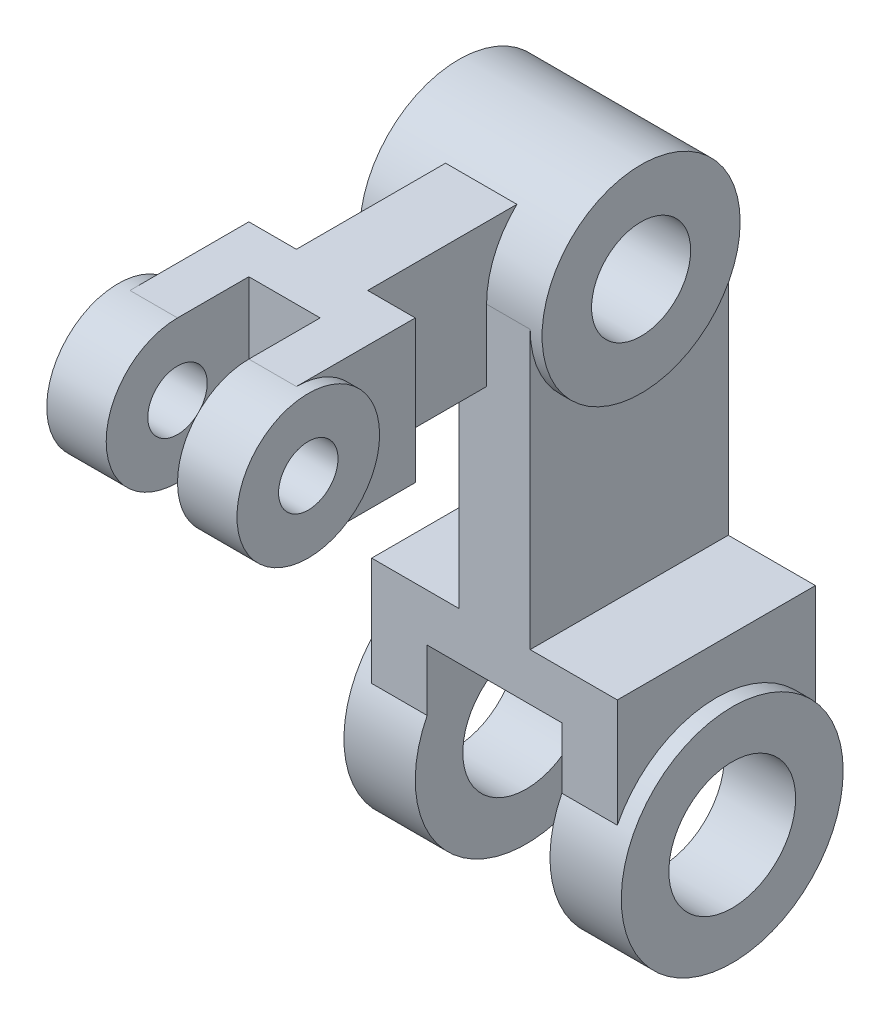
ISO-10303-21;
HEADER;
FILE_DESCRIPTION(('STEP AP214'),'2;1');
FILE_NAME('part.step','',(''),(''),'','','');
FILE_SCHEMA(('AUTOMOTIVE_DESIGN { 1 0 10303 214 1 1 1 1 }'));
ENDSEC;
DATA;
#1=APPLICATION_CONTEXT('core data for automotive mechanical design processes');
#2=APPLICATION_PROTOCOL_DEFINITION('international standard','automotive_design',2000,#1);
#3=PRODUCT_CONTEXT('',#1,'mechanical');
#4=PRODUCT('Part','Part','',(#3));
#5=PRODUCT_RELATED_PRODUCT_CATEGORY('part','',(#4));
#6=PRODUCT_DEFINITION_FORMATION('','',#4);
#7=PRODUCT_DEFINITION_CONTEXT('part definition',#1,'design');
#8=PRODUCT_DEFINITION('design','',#6,#7);
#9=PRODUCT_DEFINITION_SHAPE('','',#8);
#10=(LENGTH_UNIT() NAMED_UNIT(*) SI_UNIT(.MILLI.,.METRE.));
#11=(NAMED_UNIT(*) PLANE_ANGLE_UNIT() SI_UNIT($,.RADIAN.));
#12=(NAMED_UNIT(*) SI_UNIT($,.STERADIAN.) SOLID_ANGLE_UNIT());
#13=UNCERTAINTY_MEASURE_WITH_UNIT(LENGTH_MEASURE(1.E-05),#10,'distance_accuracy_value','');
#14=(GEOMETRIC_REPRESENTATION_CONTEXT(3) GLOBAL_UNCERTAINTY_ASSIGNED_CONTEXT((#13)) GLOBAL_UNIT_ASSIGNED_CONTEXT((#10,
#11,#12)) REPRESENTATION_CONTEXT('',''));
#15=CARTESIAN_POINT('',(0.,0.,0.));
#16=DIRECTION('',(0.,0.,1.));
#17=DIRECTION('',(1.,0.,0.));
#18=AXIS2_PLACEMENT_3D('',#15,#16,#17);
#19=CARTESIAN_POINT('',(9.,18.,0.));
#20=DIRECTION('',(0.,1.,0.));
#21=DIRECTION('',(0.,0.,1.));
#22=AXIS2_PLACEMENT_3D('',#19,#20,#21);
#23=PLANE('',#22);
#24=DIRECTION('',(1.,0.,0.));
#25=VECTOR('',#24,1.);
#26=CARTESIAN_POINT('',(9.,18.,67.));
#27=LINE('',#26,#25);
#28=CARTESIAN_POINT('',(-9.,18.,67.));
#29=VERTEX_POINT('',#28);
#30=CARTESIAN_POINT('',(9.,18.,67.));
#31=VERTEX_POINT('',#30);
#32=EDGE_CURVE('E222',#29,#31,#27,.T.);
#33=ORIENTED_EDGE('',*,*,#32,.T.);
#34=DIRECTION('',(0.,0.,1.));
#35=VECTOR('',#34,1.);
#36=CARTESIAN_POINT('',(8.99999999999999,18.,0.));
#37=LINE('',#36,#35);
#38=CARTESIAN_POINT('',(9.,18.,85.));
#39=VERTEX_POINT('',#38);
#40=EDGE_CURVE('E233',#31,#39,#37,.T.);
#41=ORIENTED_EDGE('',*,*,#40,.T.);
#42=DIRECTION('',(-1.,0.,0.));
#43=VECTOR('',#42,1.);
#44=CARTESIAN_POINT('',(21.,18.,85.));
#45=LINE('',#44,#43);
#46=CARTESIAN_POINT('',(21.,18.,85.));
#47=VERTEX_POINT('',#46);
#48=EDGE_CURVE('E266',#47,#39,#45,.T.);
#49=ORIENTED_EDGE('',*,*,#48,.F.);
#50=DIRECTION('',(0.,0.,-1.));
#51=VECTOR('',#50,1.);
#52=CARTESIAN_POINT('',(21.,18.,0.));
#53=LINE('',#52,#51);
#54=CARTESIAN_POINT('',(21.,18.,55.));
#55=VERTEX_POINT('',#54);
#56=EDGE_CURVE('E252',#47,#55,#53,.T.);
#57=ORIENTED_EDGE('',*,*,#56,.T.);
#58=DIRECTION('',(-1.,0.,0.));
#59=VECTOR('',#58,1.);
#60=CARTESIAN_POINT('',(21.,18.,55.));
#61=LINE('',#60,#59);
#62=CARTESIAN_POINT('',(9.,18.,55.));
#63=VERTEX_POINT('',#62);
#64=EDGE_CURVE('E270',#55,#63,#61,.T.);
#65=ORIENTED_EDGE('',*,*,#64,.T.);
#66=DIRECTION('',(0.,0.,-1.));
#67=VECTOR('',#66,1.);
#68=CARTESIAN_POINT('',(9.,18.,0.));
#69=LINE('',#68,#67);
#70=CARTESIAN_POINT('',(9.,18.,17.3493515728975));
#71=VERTEX_POINT('',#70);
#72=EDGE_CURVE('E293',#63,#71,#69,.T.);
#73=ORIENTED_EDGE('',*,*,#72,.T.);
#74=DIRECTION('',(-1.,0.,0.));
#75=VECTOR('',#74,1.);
#76=CARTESIAN_POINT('',(9.,18.,17.3493515728975));
#77=LINE('',#76,#75);
#78=CARTESIAN_POINT('',(-9.,18.,17.3493515728975));
#79=VERTEX_POINT('',#78);
#80=EDGE_CURVE('E320',#71,#79,#77,.T.);
#81=ORIENTED_EDGE('',*,*,#80,.T.);
#82=DIRECTION('',(0.,0.,-1.));
#83=VECTOR('',#82,1.);
#84=CARTESIAN_POINT('',(-9.,18.,0.));
#85=LINE('',#84,#83);
#86=CARTESIAN_POINT('',(-8.99999999999999,18.,55.));
#87=VERTEX_POINT('',#86);
#88=EDGE_CURVE('E306',#87,#79,#85,.T.);
#89=ORIENTED_EDGE('',*,*,#88,.F.);
#90=CARTESIAN_POINT('',(-21.,18.,55.));
#91=VERTEX_POINT('',#90);
#92=EDGE_CURVE('E269',#87,#91,#61,.T.);
#93=ORIENTED_EDGE('',*,*,#92,.T.);
#94=DIRECTION('',(0.,0.,-1.));
#95=VECTOR('',#94,1.);
#96=CARTESIAN_POINT('',(-21.,18.,0.));
#97=LINE('',#96,#95);
#98=CARTESIAN_POINT('',(-21.,18.,85.));
#99=VERTEX_POINT('',#98);
#100=EDGE_CURVE('E247',#99,#91,#97,.T.);
#101=ORIENTED_EDGE('',*,*,#100,.F.);
#102=CARTESIAN_POINT('',(-8.99999999999999,18.,85.));
#103=VERTEX_POINT('',#102);
#104=EDGE_CURVE('E255',#103,#99,#45,.T.);
#105=ORIENTED_EDGE('',*,*,#104,.F.);
#106=DIRECTION('',(0.,0.,1.));
#107=VECTOR('',#106,1.);
#108=CARTESIAN_POINT('',(-9.00000000000001,18.,0.));
#109=LINE('',#108,#107);
#110=EDGE_CURVE('E52',#29,#103,#109,.T.);
#111=ORIENTED_EDGE('',*,*,#110,.F.);
#112=EDGE_LOOP('',(#33,#41,#49,#57,#65,#73,#81,#89,#93,#101,#105,#111));
#113=FACE_BOUND('',#112,.T.);
#114=ADVANCED_FACE('F37',(#113),#23,.T.);
#115=CARTESIAN_POINT('',(9.,-18.,0.));
#116=DIRECTION('',(0.,1.,0.));
#117=DIRECTION('',(0.,0.,1.));
#118=AXIS2_PLACEMENT_3D('',#115,#116,#117);
#119=PLANE('',#118);
#120=DIRECTION('',(0.,0.,1.));
#121=VECTOR('',#120,1.);
#122=CARTESIAN_POINT('',(8.99999999999999,-18.,0.));
#123=LINE('',#122,#121);
#124=CARTESIAN_POINT('',(9.,-18.,67.));
#125=VERTEX_POINT('',#124);
#126=CARTESIAN_POINT('',(9.,-18.,85.));
#127=VERTEX_POINT('',#126);
#128=EDGE_CURVE('E228',#125,#127,#123,.T.);
#129=ORIENTED_EDGE('',*,*,#128,.F.);
#130=DIRECTION('',(1.,0.,0.));
#131=VECTOR('',#130,1.);
#132=CARTESIAN_POINT('',(9.,-18.,67.));
#133=LINE('',#132,#131);
#134=CARTESIAN_POINT('',(-9.,-18.,67.));
#135=VERTEX_POINT('',#134);
#136=EDGE_CURVE('E11',#135,#125,#133,.T.);
#137=ORIENTED_EDGE('',*,*,#136,.F.);
#138=DIRECTION('',(0.,0.,1.));
#139=VECTOR('',#138,1.);
#140=CARTESIAN_POINT('',(-9.00000000000001,-18.,0.));
#141=LINE('',#140,#139);
#142=CARTESIAN_POINT('',(-9.,-18.,85.));
#143=VERTEX_POINT('',#142);
#144=EDGE_CURVE('E207',#135,#143,#141,.T.);
#145=ORIENTED_EDGE('',*,*,#144,.T.);
#146=DIRECTION('',(-1.,0.,0.));
#147=VECTOR('',#146,1.);
#148=CARTESIAN_POINT('',(21.,-18.,85.));
#149=LINE('',#148,#147);
#150=CARTESIAN_POINT('',(-21.,-18.,85.));
#151=VERTEX_POINT('',#150);
#152=EDGE_CURVE('E276',#143,#151,#149,.T.);
#153=ORIENTED_EDGE('',*,*,#152,.T.);
#154=DIRECTION('',(0.,0.,-1.));
#155=VECTOR('',#154,1.);
#156=CARTESIAN_POINT('',(-21.,-18.,0.));
#157=LINE('',#156,#155);
#158=CARTESIAN_POINT('',(-21.,-18.,55.));
#159=VERTEX_POINT('',#158);
#160=EDGE_CURVE('E258',#151,#159,#157,.T.);
#161=ORIENTED_EDGE('',*,*,#160,.T.);
#162=DIRECTION('',(-1.,0.,0.));
#163=VECTOR('',#162,1.);
#164=CARTESIAN_POINT('',(21.,-18.,55.));
#165=LINE('',#164,#163);
#166=CARTESIAN_POINT('',(-8.99999999999999,-18.,55.));
#167=VERTEX_POINT('',#166);
#168=EDGE_CURVE('E273',#167,#159,#165,.T.);
#169=ORIENTED_EDGE('',*,*,#168,.F.);
#170=DIRECTION('',(0.,0.,-1.));
#171=VECTOR('',#170,1.);
#172=CARTESIAN_POINT('',(-9.,-18.,0.));
#173=LINE('',#172,#171);
#174=CARTESIAN_POINT('',(-9.,-18.,25.));
#175=VERTEX_POINT('',#174);
#176=EDGE_CURVE('E311',#167,#175,#173,.T.);
#177=ORIENTED_EDGE('',*,*,#176,.T.);
#178=DIRECTION('',(-1.,0.,0.));
#179=VECTOR('',#178,1.);
#180=CARTESIAN_POINT('',(9.,-18.,25.));
#181=LINE('',#180,#179);
#182=CARTESIAN_POINT('',(2.,-18.,25.));
#183=VERTEX_POINT('',#182);
#184=EDGE_CURVE('E317',#183,#175,#181,.T.);
#185=ORIENTED_EDGE('',*,*,#184,.F.);
#186=CARTESIAN_POINT('',(9.,-18.,25.));
#187=VERTEX_POINT('',#186);
#188=EDGE_CURVE('E318',#187,#183,#181,.T.);
#189=ORIENTED_EDGE('',*,*,#188,.F.);
#190=DIRECTION('',(0.,0.,-1.));
#191=VECTOR('',#190,1.);
#192=CARTESIAN_POINT('',(9.,-18.,0.));
#193=LINE('',#192,#191);
#194=CARTESIAN_POINT('',(9.,-18.,55.));
#195=VERTEX_POINT('',#194);
#196=EDGE_CURVE('E300',#195,#187,#193,.T.);
#197=ORIENTED_EDGE('',*,*,#196,.F.);
#198=CARTESIAN_POINT('',(21.,-18.,55.));
#199=VERTEX_POINT('',#198);
#200=EDGE_CURVE('E274',#199,#195,#165,.T.);
#201=ORIENTED_EDGE('',*,*,#200,.F.);
#202=DIRECTION('',(0.,0.,-1.));
#203=VECTOR('',#202,1.);
#204=CARTESIAN_POINT('',(21.,-18.,0.));
#205=LINE('',#204,#203);
#206=CARTESIAN_POINT('',(21.,-18.,85.));
#207=VERTEX_POINT('',#206);
#208=EDGE_CURVE('E246',#207,#199,#205,.T.);
#209=ORIENTED_EDGE('',*,*,#208,.F.);
#210=EDGE_CURVE('E230',#207,#127,#149,.T.);
#211=ORIENTED_EDGE('',*,*,#210,.T.);
#212=EDGE_LOOP('',(#129,#137,#145,#153,#161,#169,#177,#185,#189,#197,#201,#209,#211));
#213=FACE_BOUND('',#212,.T.);
#214=ADVANCED_FACE('F226',(#213),#119,.F.);
#215=CARTESIAN_POINT('',(24.,0.,85.));
#216=DIRECTION('',(-1.,0.,0.));
#217=DIRECTION('',(0.,0.,1.));
#218=AXIS2_PLACEMENT_3D('',#215,#216,#217);
#219=CYLINDRICAL_SURFACE('',#218,18.);
#220=CARTESIAN_POINT('',(24.,0.,85.));
#221=DIRECTION('',(1.,0.,0.));
#222=DIRECTION('',(0.,0.,-1.));
#223=AXIS2_PLACEMENT_3D('',#220,#221,#222);
#224=CIRCLE('',#223,18.);
#225=CARTESIAN_POINT('',(24.,0.,67.));
#226=VERTEX_POINT('',#225);
#227=EDGE_CURVE('E285',#226,#226,#224,.T.);
#228=ORIENTED_EDGE('',*,*,#227,.F.);
#229=EDGE_LOOP('',(#228));
#230=FACE_BOUND('',#229,.T.);
#231=CARTESIAN_POINT('',(9.,0.,85.));
#232=DIRECTION('',(-1.,0.,0.));
#233=DIRECTION('',(0.,0.,1.));
#234=AXIS2_PLACEMENT_3D('',#231,#232,#233);
#235=CIRCLE('',#234,18.);
#236=EDGE_CURVE('E234',#127,#39,#235,.T.);
#237=ORIENTED_EDGE('',*,*,#236,.F.);
#238=ORIENTED_EDGE('',*,*,#210,.F.);
#239=CARTESIAN_POINT('',(21.,0.,85.));
#240=DIRECTION('',(1.,0.,0.));
#241=DIRECTION('',(0.,0.,-1.));
#242=AXIS2_PLACEMENT_3D('',#239,#240,#241);
#243=CIRCLE('',#242,18.);
#244=EDGE_CURVE('E244',#207,#47,#243,.T.);
#245=ORIENTED_EDGE('',*,*,#244,.T.);
#246=ORIENTED_EDGE('',*,*,#48,.T.);
#247=EDGE_LOOP('',(#237,#238,#245,#246));
#248=FACE_BOUND('',#247,.T.);
#249=ADVANCED_FACE('F541',(#230,#248),#219,.T.);
#250=CARTESIAN_POINT('',(24.,0.,85.));
#251=DIRECTION('',(-1.,0.,0.));
#252=DIRECTION('',(0.,0.,1.));
#253=AXIS2_PLACEMENT_3D('',#250,#251,#252);
#254=CYLINDRICAL_SURFACE('',#253,7.50000000000001);
#255=CARTESIAN_POINT('',(24.,0.,85.));
#256=DIRECTION('',(1.,0.,0.));
#257=DIRECTION('',(0.,0.,-1.));
#258=AXIS2_PLACEMENT_3D('',#255,#256,#257);
#259=CIRCLE('',#258,7.50000000000001);
#260=CARTESIAN_POINT('',(24.,0.,77.5));
#261=VERTEX_POINT('',#260);
#262=EDGE_CURVE('E279',#261,#261,#259,.T.);
#263=ORIENTED_EDGE('',*,*,#262,.T.);
#264=EDGE_LOOP('',(#263));
#265=FACE_BOUND('',#264,.T.);
#266=CARTESIAN_POINT('',(9.,0.,85.));
#267=DIRECTION('',(-1.,0.,0.));
#268=DIRECTION('',(0.,0.,1.));
#269=AXIS2_PLACEMENT_3D('',#266,#267,#268);
#270=CIRCLE('',#269,7.50000000000001);
#271=CARTESIAN_POINT('',(9.00000000000001,0.,92.5));
#272=VERTEX_POINT('',#271);
#273=EDGE_CURVE('E238',#272,#272,#270,.T.);
#274=ORIENTED_EDGE('',*,*,#273,.T.);
#275=EDGE_LOOP('',(#274));
#276=FACE_BOUND('',#275,.T.);
#277=ADVANCED_FACE('F599',(#265,#276),#254,.F.);
#278=CARTESIAN_POINT('',(2.,0.,25.));
#279=DIRECTION('',(0.,0.,1.));
#280=DIRECTION('',(0.,-1.,0.));
#281=AXIS2_PLACEMENT_3D('',#278,#279,#280);
#282=PLANE('',#281);
#283=DIRECTION('',(0.,1.,0.));
#284=VECTOR('',#283,1.);
#285=CARTESIAN_POINT('',(9.,0.,25.));
#286=LINE('',#285,#284);
#287=CARTESIAN_POINT('',(9.,0.,25.));
#288=VERTEX_POINT('',#287);
#289=EDGE_CURVE('E60',#187,#288,#286,.T.);
#290=ORIENTED_EDGE('',*,*,#289,.F.);
#291=ORIENTED_EDGE('',*,*,#188,.T.);
#292=DIRECTION('',(0.,-1.,0.));
#293=VECTOR('',#292,1.);
#294=CARTESIAN_POINT('',(2.,0.,25.));
#295=LINE('',#294,#293);
#296=CARTESIAN_POINT('',(2.,-70.,25.));
#297=VERTEX_POINT('',#296);
#298=EDGE_CURVE('E404',#183,#297,#295,.T.);
#299=ORIENTED_EDGE('',*,*,#298,.T.);
#300=DIRECTION('',(-1.,0.,0.));
#301=VECTOR('',#300,1.);
#302=CARTESIAN_POINT('',(42.,-70.,25.));
#303=LINE('',#302,#301);
#304=CARTESIAN_POINT('',(-20.,-70.,25.));
#305=VERTEX_POINT('',#304);
#306=EDGE_CURVE('E388',#297,#305,#303,.T.);
#307=ORIENTED_EDGE('',*,*,#306,.T.);
#308=DIRECTION('',(0.,-1.,0.));
#309=VECTOR('',#308,1.);
#310=CARTESIAN_POINT('',(-20.,0.,25.));
#311=LINE('',#310,#309);
#312=CARTESIAN_POINT('',(-20.,-97.3904797870815,25.));
#313=VERTEX_POINT('',#312);
#314=EDGE_CURVE('E365',#305,#313,#311,.T.);
#315=ORIENTED_EDGE('',*,*,#314,.T.);
#316=DIRECTION('',(-1.,0.,0.));
#317=VECTOR('',#316,1.);
#318=CARTESIAN_POINT('',(42.,-97.3904797870815,25.));
#319=LINE('',#318,#317);
#320=CARTESIAN_POINT('',(-6.,-97.3904797870815,25.));
#321=VERTEX_POINT('',#320);
#322=EDGE_CURVE('E374',#321,#313,#319,.T.);
#323=ORIENTED_EDGE('',*,*,#322,.F.);
#324=DIRECTION('',(0.,-1.,0.));
#325=VECTOR('',#324,1.);
#326=CARTESIAN_POINT('',(-6.00000000000001,0.,25.));
#327=LINE('',#326,#325);
#328=CARTESIAN_POINT('',(-5.99999999999999,-82.,25.));
#329=VERTEX_POINT('',#328);
#330=EDGE_CURVE('E329',#329,#321,#327,.T.);
#331=ORIENTED_EDGE('',*,*,#330,.F.);
#332=DIRECTION('',(1.,0.,0.));
#333=VECTOR('',#332,1.);
#334=CARTESIAN_POINT('',(2.,-82.,25.));
#335=LINE('',#334,#333);
#336=CARTESIAN_POINT('',(28.,-82.,25.));
#337=VERTEX_POINT('',#336);
#338=EDGE_CURVE('E45',#329,#337,#335,.T.);
#339=ORIENTED_EDGE('',*,*,#338,.T.);
#340=DIRECTION('',(0.,-1.,0.));
#341=VECTOR('',#340,1.);
#342=CARTESIAN_POINT('',(28.,0.,25.));
#343=LINE('',#342,#341);
#344=CARTESIAN_POINT('',(28.,-97.3904797870815,25.));
#345=VERTEX_POINT('',#344);
#346=EDGE_CURVE('E337',#337,#345,#343,.T.);
#347=ORIENTED_EDGE('',*,*,#346,.T.);
#348=CARTESIAN_POINT('',(42.,-97.3904797870815,25.));
#349=VERTEX_POINT('',#348);
#350=EDGE_CURVE('E385',#349,#345,#319,.T.);
#351=ORIENTED_EDGE('',*,*,#350,.F.);
#352=DIRECTION('',(0.,-1.,0.));
#353=VECTOR('',#352,1.);
#354=CARTESIAN_POINT('',(42.,0.,25.));
#355=LINE('',#354,#353);
#356=CARTESIAN_POINT('',(42.,-70.,25.));
#357=VERTEX_POINT('',#356);
#358=EDGE_CURVE('E371',#357,#349,#355,.T.);
#359=ORIENTED_EDGE('',*,*,#358,.F.);
#360=CARTESIAN_POINT('',(20.,-70.,25.));
#361=VERTEX_POINT('',#360);
#362=EDGE_CURVE('E389',#357,#361,#303,.T.);
#363=ORIENTED_EDGE('',*,*,#362,.T.);
#364=DIRECTION('',(0.,-1.,0.));
#365=VECTOR('',#364,1.);
#366=CARTESIAN_POINT('',(20.,0.,25.));
#367=LINE('',#366,#365);
#368=CARTESIAN_POINT('',(20.,0.,25.));
#369=VERTEX_POINT('',#368);
#370=EDGE_CURVE('E418',#369,#361,#367,.T.);
#371=ORIENTED_EDGE('',*,*,#370,.F.);
#372=DIRECTION('',(1.,0.,0.));
#373=VECTOR('',#372,1.);
#374=CARTESIAN_POINT('',(2.,0.,25.));
#375=LINE('',#374,#373);
#376=EDGE_CURVE('E415',#288,#369,#375,.T.);
#377=ORIENTED_EDGE('',*,*,#376,.F.);
#378=EDGE_LOOP('',(#290,#291,#299,#307,#315,#323,#331,#339,#347,#351,#359,#363,#371,#377));
#379=FACE_BOUND('',#378,.T.);
#380=ADVANCED_FACE('F479',(#379),#282,.T.);
#381=CARTESIAN_POINT('',(2.,-70.,-25.));
#382=DIRECTION('',(0.,0.,-1.));
#383=DIRECTION('',(-1.,0.,0.));
#384=AXIS2_PLACEMENT_3D('',#381,#382,#383);
#385=PLANE('',#384);
#386=DIRECTION('',(-1.,0.,0.));
#387=VECTOR('',#386,1.);
#388=CARTESIAN_POINT('',(42.,-97.3904797870815,-25.));
#389=LINE('',#388,#387);
#390=CARTESIAN_POINT('',(42.,-97.3904797870816,-25.));
#391=VERTEX_POINT('',#390);
#392=CARTESIAN_POINT('',(28.,-97.3904797870815,-25.));
#393=VERTEX_POINT('',#392);
#394=EDGE_CURVE('E397',#391,#393,#389,.T.);
#395=ORIENTED_EDGE('',*,*,#394,.T.);
#396=DIRECTION('',(0.,1.,0.));
#397=VECTOR('',#396,1.);
#398=CARTESIAN_POINT('',(28.,-70.,-25.));
#399=LINE('',#398,#397);
#400=CARTESIAN_POINT('',(28.,-82.,-25.));
#401=VERTEX_POINT('',#400);
#402=EDGE_CURVE('E340',#393,#401,#399,.T.);
#403=ORIENTED_EDGE('',*,*,#402,.T.);
#404=DIRECTION('',(-1.,0.,0.));
#405=VECTOR('',#404,1.);
#406=CARTESIAN_POINT('',(2.,-82.,-25.));
#407=LINE('',#406,#405);
#408=CARTESIAN_POINT('',(-5.99999999999999,-82.,-25.));
#409=VERTEX_POINT('',#408);
#410=EDGE_CURVE('E346',#401,#409,#407,.T.);
#411=ORIENTED_EDGE('',*,*,#410,.T.);
#412=DIRECTION('',(0.,1.,0.));
#413=VECTOR('',#412,1.);
#414=CARTESIAN_POINT('',(-6.,-70.,-25.));
#415=LINE('',#414,#413);
#416=CARTESIAN_POINT('',(-6.,-97.3904797870815,-25.));
#417=VERTEX_POINT('',#416);
#418=EDGE_CURVE('E332',#417,#409,#415,.T.);
#419=ORIENTED_EDGE('',*,*,#418,.F.);
#420=CARTESIAN_POINT('',(-20.,-97.3904797870815,-25.));
#421=VERTEX_POINT('',#420);
#422=EDGE_CURVE('E396',#417,#421,#389,.T.);
#423=ORIENTED_EDGE('',*,*,#422,.T.);
#424=DIRECTION('',(0.,-1.,0.));
#425=VECTOR('',#424,1.);
#426=CARTESIAN_POINT('',(-20.,0.,-25.));
#427=LINE('',#426,#425);
#428=CARTESIAN_POINT('',(-20.,-70.,-25.));
#429=VERTEX_POINT('',#428);
#430=EDGE_CURVE('E377',#429,#421,#427,.T.);
#431=ORIENTED_EDGE('',*,*,#430,.F.);
#432=DIRECTION('',(-1.,0.,0.));
#433=VECTOR('',#432,1.);
#434=CARTESIAN_POINT('',(42.,-70.,-25.));
#435=LINE('',#434,#433);
#436=CARTESIAN_POINT('',(2.,-70.,-25.));
#437=VERTEX_POINT('',#436);
#438=EDGE_CURVE('E392',#437,#429,#435,.T.);
#439=ORIENTED_EDGE('',*,*,#438,.F.);
#440=DIRECTION('',(0.,1.,0.));
#441=VECTOR('',#440,1.);
#442=CARTESIAN_POINT('',(2.,-70.,-25.));
#443=LINE('',#442,#441);
#444=CARTESIAN_POINT('',(2.,0.,-25.));
#445=VERTEX_POINT('',#444);
#446=EDGE_CURVE('E412',#437,#445,#443,.T.);
#447=ORIENTED_EDGE('',*,*,#446,.T.);
#448=DIRECTION('',(1.,0.,0.));
#449=VECTOR('',#448,1.);
#450=CARTESIAN_POINT('',(2.,0.,-25.));
#451=LINE('',#450,#449);
#452=CARTESIAN_POINT('',(20.,0.,-25.));
#453=VERTEX_POINT('',#452);
#454=EDGE_CURVE('E423',#445,#453,#451,.T.);
#455=ORIENTED_EDGE('',*,*,#454,.T.);
#456=DIRECTION('',(0.,1.,0.));
#457=VECTOR('',#456,1.);
#458=CARTESIAN_POINT('',(20.,-70.,-25.));
#459=LINE('',#458,#457);
#460=CARTESIAN_POINT('',(20.,-70.,-25.));
#461=VERTEX_POINT('',#460);
#462=EDGE_CURVE('E405',#461,#453,#459,.T.);
#463=ORIENTED_EDGE('',*,*,#462,.F.);
#464=CARTESIAN_POINT('',(42.,-70.,-25.));
#465=VERTEX_POINT('',#464);
#466=EDGE_CURVE('E393',#465,#461,#435,.T.);
#467=ORIENTED_EDGE('',*,*,#466,.F.);
#468=DIRECTION('',(0.,-1.,0.));
#469=VECTOR('',#468,1.);
#470=CARTESIAN_POINT('',(42.,0.,-25.));
#471=LINE('',#470,#469);
#472=EDGE_CURVE('E364',#465,#391,#471,.T.);
#473=ORIENTED_EDGE('',*,*,#472,.T.);
#474=EDGE_LOOP('',(#395,#403,#411,#419,#423,#431,#439,#447,#455,#463,#467,#473));
#475=FACE_BOUND('',#474,.T.);
#476=ADVANCED_FACE('F506',(#475),#385,.T.);
#477=CARTESIAN_POINT('',(46.,-110.,0.));
#478=DIRECTION('',(-1.,0.,0.));
#479=DIRECTION('',(0.,0.,1.));
#480=AXIS2_PLACEMENT_3D('',#477,#478,#479);
#481=CYLINDRICAL_SURFACE('',#480,16.);
#482=CARTESIAN_POINT('',(46.,-110.,0.));
#483=DIRECTION('',(1.,0.,0.));
#484=DIRECTION('',(0.,0.,-1.));
#485=AXIS2_PLACEMENT_3D('',#482,#483,#484);
#486=CIRCLE('',#485,16.);
#487=CARTESIAN_POINT('',(46.,-110.,-16.));
#488=VERTEX_POINT('',#487);
#489=EDGE_CURVE('E350',#488,#488,#486,.T.);
#490=ORIENTED_EDGE('',*,*,#489,.T.);
#491=EDGE_LOOP('',(#490));
#492=FACE_BOUND('',#491,.T.);
#493=CARTESIAN_POINT('',(28.,-110.,0.));
#494=DIRECTION('',(-1.,0.,0.));
#495=DIRECTION('',(0.,-1.,0.));
#496=AXIS2_PLACEMENT_3D('',#493,#494,#495);
#497=CIRCLE('',#496,16.);
#498=CARTESIAN_POINT('',(28.,-126.,0.));
#499=VERTEX_POINT('',#498);
#500=EDGE_CURVE('E343',#499,#499,#497,.T.);
#501=ORIENTED_EDGE('',*,*,#500,.T.);
#502=EDGE_LOOP('',(#501));
#503=FACE_BOUND('',#502,.T.);
#504=ADVANCED_FACE('F579',(#492,#503),#481,.F.);
#505=CARTESIAN_POINT('',(46.,-110.,0.));
#506=DIRECTION('',(-1.,0.,0.));
#507=DIRECTION('',(0.,0.,1.));
#508=AXIS2_PLACEMENT_3D('',#505,#506,#507);
#509=CYLINDRICAL_SURFACE('',#508,28.);
#510=CARTESIAN_POINT('',(46.,-110.,0.));
#511=DIRECTION('',(1.,0.,0.));
#512=DIRECTION('',(0.,0.,-1.));
#513=AXIS2_PLACEMENT_3D('',#510,#511,#512);
#514=CIRCLE('',#513,28.);
#515=CARTESIAN_POINT('',(46.,-110.,-28.));
#516=VERTEX_POINT('',#515);
#517=EDGE_CURVE('E353',#516,#516,#514,.T.);
#518=ORIENTED_EDGE('',*,*,#517,.F.);
#519=EDGE_LOOP('',(#518));
#520=FACE_BOUND('',#519,.T.);
#521=ORIENTED_EDGE('',*,*,#350,.T.);
#522=CARTESIAN_POINT('',(28.,-110.,0.));
#523=DIRECTION('',(-1.,0.,0.));
#524=DIRECTION('',(0.,-1.,0.));
#525=AXIS2_PLACEMENT_3D('',#522,#523,#524);
#526=CIRCLE('',#525,28.);
#527=EDGE_CURVE('E441',#393,#345,#526,.T.);
#528=ORIENTED_EDGE('',*,*,#527,.F.);
#529=ORIENTED_EDGE('',*,*,#394,.F.);
#530=CARTESIAN_POINT('',(42.,-110.,0.));
#531=DIRECTION('',(1.,0.,0.));
#532=DIRECTION('',(0.,0.,-1.));
#533=AXIS2_PLACEMENT_3D('',#530,#531,#532);
#534=CIRCLE('',#533,28.);
#535=EDGE_CURVE('E362',#391,#349,#534,.T.);
#536=ORIENTED_EDGE('',*,*,#535,.T.);
#537=EDGE_LOOP('',(#521,#528,#529,#536));
#538=FACE_BOUND('',#537,.T.);
#539=ADVANCED_FACE('F513',(#520,#538),#509,.T.);
#540=CARTESIAN_POINT('',(-24.,-110.,0.));
#541=DIRECTION('',(1.,0.,0.));
#542=DIRECTION('',(0.,0.,-1.));
#543=AXIS2_PLACEMENT_3D('',#540,#541,#542);
#544=CIRCLE('',#543,28.);
#545=CARTESIAN_POINT('',(-24.,-110.,-28.));
#546=VERTEX_POINT('',#545);
#547=EDGE_CURVE('E354',#546,#546,#544,.T.);
#548=ORIENTED_EDGE('',*,*,#547,.T.);
#549=EDGE_LOOP('',(#548));
#550=FACE_BOUND('',#549,.T.);
#551=CARTESIAN_POINT('',(-6.,-110.,0.));
#552=DIRECTION('',(-1.,0.,0.));
#553=DIRECTION('',(0.,-1.,0.));
#554=AXIS2_PLACEMENT_3D('',#551,#552,#553);
#555=CIRCLE('',#554,28.);
#556=EDGE_CURVE('E437',#417,#321,#555,.T.);
#557=ORIENTED_EDGE('',*,*,#556,.T.);
#558=ORIENTED_EDGE('',*,*,#322,.T.);
#559=CARTESIAN_POINT('',(-20.,-110.,0.));
#560=DIRECTION('',(1.,0.,0.));
#561=DIRECTION('',(0.,0.,-1.));
#562=AXIS2_PLACEMENT_3D('',#559,#560,#561);
#563=CIRCLE('',#562,28.);
#564=EDGE_CURVE('E357',#421,#313,#563,.T.);
#565=ORIENTED_EDGE('',*,*,#564,.F.);
#566=ORIENTED_EDGE('',*,*,#422,.F.);
#567=EDGE_LOOP('',(#557,#558,#565,#566));
#568=FACE_BOUND('',#567,.T.);
#569=ADVANCED_FACE('F496',(#550,#568),#509,.T.);
#570=CARTESIAN_POINT('',(23.,0.,0.));
#571=DIRECTION('',(-1.,0.,0.));
#572=DIRECTION('',(0.,0.,1.));
#573=AXIS2_PLACEMENT_3D('',#570,#571,#572);
#574=CYLINDRICAL_SURFACE('',#573,25.);
#575=CARTESIAN_POINT('',(-23.,0.,0.));
#576=DIRECTION('',(1.,0.,0.));
#577=DIRECTION('',(0.,0.,-1.));
#578=AXIS2_PLACEMENT_3D('',#575,#576,#577);
#579=CIRCLE('',#578,25.);
#580=CARTESIAN_POINT('',(-23.,0.,-25.));
#581=VERTEX_POINT('',#580);
#582=EDGE_CURVE('E431',#581,#581,#579,.T.);
#583=ORIENTED_EDGE('',*,*,#582,.T.);
#584=EDGE_LOOP('',(#583));
#585=FACE_BOUND('',#584,.T.);
#586=CARTESIAN_POINT('',(23.,0.,0.));
#587=DIRECTION('',(1.,0.,0.));
#588=DIRECTION('',(0.,0.,-1.));
#589=AXIS2_PLACEMENT_3D('',#586,#587,#588);
#590=CIRCLE('',#589,25.);
#591=CARTESIAN_POINT('',(23.,0.,-25.));
#592=VERTEX_POINT('',#591);
#593=EDGE_CURVE('E434',#592,#592,#590,.T.);
#594=ORIENTED_EDGE('',*,*,#593,.F.);
#595=EDGE_LOOP('',(#594));
#596=FACE_BOUND('',#595,.T.);
#597=ORIENTED_EDGE('',*,*,#80,.F.);
#598=CARTESIAN_POINT('',(9.,0.,0.));
#599=DIRECTION('',(1.,0.,0.));
#600=DIRECTION('',(0.,0.,-1.));
#601=AXIS2_PLACEMENT_3D('',#598,#599,#600);
#602=CIRCLE('',#601,25.);
#603=EDGE_CURVE('E291',#71,#288,#602,.T.);
#604=ORIENTED_EDGE('',*,*,#603,.T.);
#605=ORIENTED_EDGE('',*,*,#376,.T.);
#606=CARTESIAN_POINT('',(20.,0.,0.));
#607=DIRECTION('',(-1.,0.,0.));
#608=DIRECTION('',(0.,0.,-1.));
#609=AXIS2_PLACEMENT_3D('',#606,#607,#608);
#610=CIRCLE('',#609,25.);
#611=EDGE_CURVE('E400',#453,#369,#610,.T.);
#612=ORIENTED_EDGE('',*,*,#611,.F.);
#613=ORIENTED_EDGE('',*,*,#454,.F.);
#614=CARTESIAN_POINT('',(2.,0.,0.));
#615=DIRECTION('',(-1.,0.,0.));
#616=DIRECTION('',(0.,0.,-1.));
#617=AXIS2_PLACEMENT_3D('',#614,#615,#616);
#618=CIRCLE('',#617,25.);
#619=CARTESIAN_POINT('',(2.,0.,25.));
#620=VERTEX_POINT('',#619);
#621=EDGE_CURVE('E401',#445,#620,#618,.T.);
#622=ORIENTED_EDGE('',*,*,#621,.T.);
#623=DIRECTION('',(-1.,0.,0.));
#624=VECTOR('',#623,1.);
#625=CARTESIAN_POINT('',(9.,0.,25.));
#626=LINE('',#625,#624);
#627=CARTESIAN_POINT('',(-9.,0.,25.));
#628=VERTEX_POINT('',#627);
#629=EDGE_CURVE('E303',#620,#628,#626,.T.);
#630=ORIENTED_EDGE('',*,*,#629,.T.);
#631=CARTESIAN_POINT('',(-9.,0.,0.));
#632=DIRECTION('',(1.,0.,0.));
#633=DIRECTION('',(0.,0.,-1.));
#634=AXIS2_PLACEMENT_3D('',#631,#632,#633);
#635=CIRCLE('',#634,25.);
#636=EDGE_CURVE('E288',#79,#628,#635,.T.);
#637=ORIENTED_EDGE('',*,*,#636,.F.);
#638=EDGE_LOOP('',(#597,#604,#605,#612,#613,#622,#630,#637));
#639=FACE_BOUND('',#638,.T.);
#640=ADVANCED_FACE('F39',(#585,#596,#639),#574,.T.);
#641=CARTESIAN_POINT('',(23.,0.,0.));
#642=DIRECTION('',(1.,0.,0.));
#643=DIRECTION('',(0.,0.,-1.));
#644=AXIS2_PLACEMENT_3D('',#641,#642,#643);
#645=PLANE('',#644);
#646=ORIENTED_EDGE('',*,*,#593,.T.);
#647=EDGE_LOOP('',(#646));
#648=FACE_BOUND('',#647,.T.);
#649=CARTESIAN_POINT('',(23.,0.,0.));
#650=DIRECTION('',(1.,0.,0.));
#651=DIRECTION('',(0.,0.,-1.));
#652=AXIS2_PLACEMENT_3D('',#649,#650,#651);
#653=CIRCLE('',#652,12.5);
#654=CARTESIAN_POINT('',(23.,0.,-12.5));
#655=VERTEX_POINT('',#654);
#656=EDGE_CURVE('E428',#655,#655,#653,.T.);
#657=ORIENTED_EDGE('',*,*,#656,.F.);
#658=EDGE_LOOP('',(#657));
#659=FACE_BOUND('',#658,.T.);
#660=ADVANCED_FACE('F604',(#648,#659),#645,.T.);
#661=CARTESIAN_POINT('',(-23.,0.,0.));
#662=DIRECTION('',(1.,0.,0.));
#663=DIRECTION('',(0.,0.,-1.));
#664=AXIS2_PLACEMENT_3D('',#661,#662,#663);
#665=PLANE('',#664);
#666=ORIENTED_EDGE('',*,*,#582,.F.);
#667=EDGE_LOOP('',(#666));
#668=FACE_BOUND('',#667,.T.);
#669=CARTESIAN_POINT('',(-23.,0.,0.));
#670=DIRECTION('',(1.,0.,0.));
#671=DIRECTION('',(0.,0.,-1.));
#672=AXIS2_PLACEMENT_3D('',#669,#670,#671);
#673=CIRCLE('',#672,12.5);
#674=CARTESIAN_POINT('',(-23.,0.,-12.5));
#675=VERTEX_POINT('',#674);
#676=EDGE_CURVE('E426',#675,#675,#673,.T.);
#677=ORIENTED_EDGE('',*,*,#676,.T.);
#678=EDGE_LOOP('',(#677));
#679=FACE_BOUND('',#678,.T.);
#680=ADVANCED_FACE('F602',(#668,#679),#665,.F.);
#681=CARTESIAN_POINT('',(23.,0.,0.));
#682=DIRECTION('',(-1.,0.,0.));
#683=DIRECTION('',(0.,0.,1.));
#684=AXIS2_PLACEMENT_3D('',#681,#682,#683);
#685=CYLINDRICAL_SURFACE('',#684,12.5);
#686=ORIENTED_EDGE('',*,*,#656,.T.);
#687=EDGE_LOOP('',(#686));
#688=FACE_BOUND('',#687,.T.);
#689=ORIENTED_EDGE('',*,*,#676,.F.);
#690=EDGE_LOOP('',(#689));
#691=FACE_BOUND('',#690,.T.);
#692=ADVANCED_FACE('F592',(#688,#691),#685,.F.);
#693=CARTESIAN_POINT('',(2.,0.,0.));
#694=DIRECTION('',(1.,0.,0.));
#695=DIRECTION('',(0.,0.,-1.));
#696=AXIS2_PLACEMENT_3D('',#693,#694,#695);
#697=PLANE('',#696);
#698=ORIENTED_EDGE('',*,*,#621,.F.);
#699=ORIENTED_EDGE('',*,*,#446,.F.);
#700=DIRECTION('',(0.,0.,-1.));
#701=VECTOR('',#700,1.);
#702=CARTESIAN_POINT('',(2.,-70.,25.));
#703=LINE('',#702,#701);
#704=EDGE_CURVE('E409',#297,#437,#703,.T.);
#705=ORIENTED_EDGE('',*,*,#704,.F.);
#706=ORIENTED_EDGE('',*,*,#298,.F.);
#707=EDGE_CURVE('E406',#620,#183,#295,.T.);
#708=ORIENTED_EDGE('',*,*,#707,.F.);
#709=EDGE_LOOP('',(#698,#699,#705,#706,#708));
#710=FACE_BOUND('',#709,.T.);
#711=ADVANCED_FACE('F484',(#710),#697,.F.);
#712=CARTESIAN_POINT('',(20.,0.,0.));
#713=DIRECTION('',(1.,0.,0.));
#714=DIRECTION('',(0.,0.,-1.));
#715=AXIS2_PLACEMENT_3D('',#712,#713,#714);
#716=PLANE('',#715);
#717=ORIENTED_EDGE('',*,*,#611,.T.);
#718=ORIENTED_EDGE('',*,*,#370,.T.);
#719=DIRECTION('',(0.,0.,-1.));
#720=VECTOR('',#719,1.);
#721=CARTESIAN_POINT('',(20.,-70.,25.));
#722=LINE('',#721,#720);
#723=EDGE_CURVE('E420',#361,#461,#722,.T.);
#724=ORIENTED_EDGE('',*,*,#723,.T.);
#725=ORIENTED_EDGE('',*,*,#462,.T.);
#726=EDGE_LOOP('',(#717,#718,#724,#725));
#727=FACE_BOUND('',#726,.T.);
#728=ADVANCED_FACE('F525',(#727),#716,.T.);
#729=CARTESIAN_POINT('',(42.,-70.,0.));
#730=DIRECTION('',(0.,1.,0.));
#731=DIRECTION('',(0.,0.,1.));
#732=AXIS2_PLACEMENT_3D('',#729,#730,#731);
#733=PLANE('',#732);
#734=ORIENTED_EDGE('',*,*,#723,.F.);
#735=ORIENTED_EDGE('',*,*,#362,.F.);
#736=DIRECTION('',(0.,0.,-1.));
#737=VECTOR('',#736,1.);
#738=CARTESIAN_POINT('',(42.,-70.,0.));
#739=LINE('',#738,#737);
#740=EDGE_CURVE('E368',#357,#465,#739,.T.);
#741=ORIENTED_EDGE('',*,*,#740,.T.);
#742=ORIENTED_EDGE('',*,*,#466,.T.);
#743=EDGE_LOOP('',(#734,#735,#741,#742));
#744=FACE_BOUND('',#743,.T.);
#745=ADVANCED_FACE('F522',(#744),#733,.T.);
#746=ORIENTED_EDGE('',*,*,#306,.F.);
#747=ORIENTED_EDGE('',*,*,#704,.T.);
#748=ORIENTED_EDGE('',*,*,#438,.T.);
#749=DIRECTION('',(0.,0.,-1.));
#750=VECTOR('',#749,1.);
#751=CARTESIAN_POINT('',(-20.,-70.,0.));
#752=LINE('',#751,#750);
#753=EDGE_CURVE('E380',#305,#429,#752,.T.);
#754=ORIENTED_EDGE('',*,*,#753,.F.);
#755=EDGE_LOOP('',(#746,#747,#748,#754));
#756=FACE_BOUND('',#755,.T.);
#757=ADVANCED_FACE('F488',(#756),#733,.T.);
#758=CARTESIAN_POINT('',(42.,0.,0.));
#759=DIRECTION('',(1.,0.,0.));
#760=DIRECTION('',(0.,0.,-1.));
#761=AXIS2_PLACEMENT_3D('',#758,#759,#760);
#762=PLANE('',#761);
#763=ORIENTED_EDGE('',*,*,#535,.F.);
#764=ORIENTED_EDGE('',*,*,#472,.F.);
#765=ORIENTED_EDGE('',*,*,#740,.F.);
#766=ORIENTED_EDGE('',*,*,#358,.T.);
#767=EDGE_LOOP('',(#763,#764,#765,#766));
#768=FACE_BOUND('',#767,.T.);
#769=ADVANCED_FACE('F518',(#768),#762,.T.);
#770=CARTESIAN_POINT('',(-20.,0.,0.));
#771=DIRECTION('',(1.,0.,0.));
#772=DIRECTION('',(0.,0.,-1.));
#773=AXIS2_PLACEMENT_3D('',#770,#771,#772);
#774=PLANE('',#773);
#775=ORIENTED_EDGE('',*,*,#564,.T.);
#776=ORIENTED_EDGE('',*,*,#314,.F.);
#777=ORIENTED_EDGE('',*,*,#753,.T.);
#778=ORIENTED_EDGE('',*,*,#430,.T.);
#779=EDGE_LOOP('',(#775,#776,#777,#778));
#780=FACE_BOUND('',#779,.T.);
#781=ADVANCED_FACE('F491',(#780),#774,.F.);
#782=CARTESIAN_POINT('',(-6.,-110.,0.));
#783=DIRECTION('',(-1.,0.,0.));
#784=DIRECTION('',(0.,-1.,0.));
#785=AXIS2_PLACEMENT_3D('',#782,#783,#784);
#786=CIRCLE('',#785,16.);
#787=CARTESIAN_POINT('',(-6.,-126.,0.));
#788=VERTEX_POINT('',#787);
#789=EDGE_CURVE('E334',#788,#788,#786,.T.);
#790=ORIENTED_EDGE('',*,*,#789,.F.);
#791=EDGE_LOOP('',(#790));
#792=FACE_BOUND('',#791,.T.);
#793=CARTESIAN_POINT('',(-24.,-110.,0.));
#794=DIRECTION('',(1.,0.,0.));
#795=DIRECTION('',(0.,0.,-1.));
#796=AXIS2_PLACEMENT_3D('',#793,#794,#795);
#797=CIRCLE('',#796,16.);
#798=CARTESIAN_POINT('',(-24.,-110.,-16.));
#799=VERTEX_POINT('',#798);
#800=EDGE_CURVE('E349',#799,#799,#797,.T.);
#801=ORIENTED_EDGE('',*,*,#800,.F.);
#802=EDGE_LOOP('',(#801));
#803=FACE_BOUND('',#802,.T.);
#804=ADVANCED_FACE('F572',(#792,#803),#481,.F.);
#805=CARTESIAN_POINT('',(46.,0.,0.));
#806=DIRECTION('',(1.,0.,0.));
#807=DIRECTION('',(0.,0.,-1.));
#808=AXIS2_PLACEMENT_3D('',#805,#806,#807);
#809=PLANE('',#808);
#810=ORIENTED_EDGE('',*,*,#489,.F.);
#811=EDGE_LOOP('',(#810));
#812=FACE_BOUND('',#811,.T.);
#813=ORIENTED_EDGE('',*,*,#517,.T.);
#814=EDGE_LOOP('',(#813));
#815=FACE_BOUND('',#814,.T.);
#816=ADVANCED_FACE('F569',(#812,#815),#809,.T.);
#817=CARTESIAN_POINT('',(-24.,0.,0.));
#818=DIRECTION('',(1.,0.,0.));
#819=DIRECTION('',(0.,0.,-1.));
#820=AXIS2_PLACEMENT_3D('',#817,#818,#819);
#821=PLANE('',#820);
#822=ORIENTED_EDGE('',*,*,#800,.T.);
#823=EDGE_LOOP('',(#822));
#824=FACE_BOUND('',#823,.T.);
#825=ORIENTED_EDGE('',*,*,#547,.F.);
#826=EDGE_LOOP('',(#825));
#827=FACE_BOUND('',#826,.T.);
#828=ADVANCED_FACE('F565',(#824,#827),#821,.F.);
#829=CARTESIAN_POINT('',(28.,-82.,-28.));
#830=DIRECTION('',(-1.,0.,0.));
#831=DIRECTION('',(0.,-1.,0.));
#832=AXIS2_PLACEMENT_3D('',#829,#830,#831);
#833=PLANE('',#832);
#834=ORIENTED_EDGE('',*,*,#500,.F.);
#835=EDGE_LOOP('',(#834));
#836=FACE_BOUND('',#835,.T.);
#837=ORIENTED_EDGE('',*,*,#402,.F.);
#838=ORIENTED_EDGE('',*,*,#527,.T.);
#839=ORIENTED_EDGE('',*,*,#346,.F.);
#840=DIRECTION('',(0.,0.,1.));
#841=VECTOR('',#840,1.);
#842=CARTESIAN_POINT('',(28.,-82.,-28.));
#843=LINE('',#842,#841);
#844=EDGE_CURVE('E326',#401,#337,#843,.T.);
#845=ORIENTED_EDGE('',*,*,#844,.F.);
#846=EDGE_LOOP('',(#837,#838,#839,#845));
#847=FACE_BOUND('',#846,.T.);
#848=ADVANCED_FACE('F509',(#836,#847),#833,.T.);
#849=CARTESIAN_POINT('',(-5.99999999999999,-82.,-28.));
#850=DIRECTION('',(-1.,0.,0.));
#851=DIRECTION('',(0.,-1.,0.));
#852=AXIS2_PLACEMENT_3D('',#849,#850,#851);
#853=PLANE('',#852);
#854=ORIENTED_EDGE('',*,*,#789,.T.);
#855=EDGE_LOOP('',(#854));
#856=FACE_BOUND('',#855,.T.);
#857=ORIENTED_EDGE('',*,*,#418,.T.);
#858=DIRECTION('',(0.,0.,1.));
#859=VECTOR('',#858,1.);
#860=CARTESIAN_POINT('',(-5.99999999999999,-82.,-28.));
#861=LINE('',#860,#859);
#862=EDGE_CURVE('E323',#409,#329,#861,.T.);
#863=ORIENTED_EDGE('',*,*,#862,.T.);
#864=ORIENTED_EDGE('',*,*,#330,.T.);
#865=ORIENTED_EDGE('',*,*,#556,.F.);
#866=EDGE_LOOP('',(#857,#863,#864,#865));
#867=FACE_BOUND('',#866,.T.);
#868=ADVANCED_FACE('F500',(#856,#867),#853,.F.);
#869=CARTESIAN_POINT('',(-5.99999999999999,-82.,-28.));
#870=DIRECTION('',(0.,-1.,0.));
#871=DIRECTION('',(0.,0.,-1.));
#872=AXIS2_PLACEMENT_3D('',#869,#870,#871);
#873=PLANE('',#872);
#874=ORIENTED_EDGE('',*,*,#844,.T.);
#875=ORIENTED_EDGE('',*,*,#338,.F.);
#876=ORIENTED_EDGE('',*,*,#862,.F.);
#877=ORIENTED_EDGE('',*,*,#410,.F.);
#878=EDGE_LOOP('',(#874,#875,#876,#877));
#879=FACE_BOUND('',#878,.T.);
#880=ADVANCED_FACE('F503',(#879),#873,.T.);
#881=CARTESIAN_POINT('',(9.,0.,25.));
#882=DIRECTION('',(0.,0.,1.));
#883=DIRECTION('',(1.,0.,0.));
#884=AXIS2_PLACEMENT_3D('',#881,#882,#883);
#885=PLANE('',#884);
#886=ORIENTED_EDGE('',*,*,#629,.F.);
#887=ORIENTED_EDGE('',*,*,#707,.T.);
#888=ORIENTED_EDGE('',*,*,#184,.T.);
#889=DIRECTION('',(0.,1.,0.));
#890=VECTOR('',#889,1.);
#891=CARTESIAN_POINT('',(-9.,0.,25.));
#892=LINE('',#891,#890);
#893=EDGE_CURVE('E294',#175,#628,#892,.T.);
#894=ORIENTED_EDGE('',*,*,#893,.T.);
#895=EDGE_LOOP('',(#886,#887,#888,#894));
#896=FACE_BOUND('',#895,.T.);
#897=ADVANCED_FACE('F475',(#896),#885,.F.);
#898=CARTESIAN_POINT('',(9.,0.,0.));
#899=DIRECTION('',(1.,0.,0.));
#900=DIRECTION('',(0.,0.,-1.));
#901=AXIS2_PLACEMENT_3D('',#898,#899,#900);
#902=PLANE('',#901);
#903=ORIENTED_EDGE('',*,*,#603,.F.);
#904=ORIENTED_EDGE('',*,*,#72,.F.);
#905=DIRECTION('',(0.,-1.,0.));
#906=VECTOR('',#905,1.);
#907=CARTESIAN_POINT('',(9.,0.,55.));
#908=LINE('',#907,#906);
#909=EDGE_CURVE('E297',#63,#195,#908,.T.);
#910=ORIENTED_EDGE('',*,*,#909,.T.);
#911=ORIENTED_EDGE('',*,*,#196,.T.);
#912=ORIENTED_EDGE('',*,*,#289,.T.);
#913=EDGE_LOOP('',(#903,#904,#910,#911,#912));
#914=FACE_BOUND('',#913,.T.);
#915=ADVANCED_FACE('F531',(#914),#902,.T.);
#916=CARTESIAN_POINT('',(-9.,0.,0.));
#917=DIRECTION('',(1.,0.,0.));
#918=DIRECTION('',(0.,0.,-1.));
#919=AXIS2_PLACEMENT_3D('',#916,#917,#918);
#920=PLANE('',#919);
#921=ORIENTED_EDGE('',*,*,#636,.T.);
#922=ORIENTED_EDGE('',*,*,#893,.F.);
#923=ORIENTED_EDGE('',*,*,#176,.F.);
#924=DIRECTION('',(0.,-1.,0.));
#925=VECTOR('',#924,1.);
#926=CARTESIAN_POINT('',(-9.,0.,55.));
#927=LINE('',#926,#925);
#928=EDGE_CURVE('E309',#87,#167,#927,.T.);
#929=ORIENTED_EDGE('',*,*,#928,.F.);
#930=ORIENTED_EDGE('',*,*,#88,.T.);
#931=EDGE_LOOP('',(#921,#922,#923,#929,#930));
#932=FACE_BOUND('',#931,.T.);
#933=ADVANCED_FACE('F471',(#932),#920,.F.);
#934=CARTESIAN_POINT('',(21.,0.,55.));
#935=DIRECTION('',(0.,0.,-1.));
#936=DIRECTION('',(-1.,0.,0.));
#937=AXIS2_PLACEMENT_3D('',#934,#935,#936);
#938=PLANE('',#937);
#939=ORIENTED_EDGE('',*,*,#909,.F.);
#940=ORIENTED_EDGE('',*,*,#64,.F.);
#941=DIRECTION('',(0.,-1.,0.));
#942=VECTOR('',#941,1.);
#943=CARTESIAN_POINT('',(21.,0.,55.));
#944=LINE('',#943,#942);
#945=EDGE_CURVE('E249',#55,#199,#944,.T.);
#946=ORIENTED_EDGE('',*,*,#945,.T.);
#947=ORIENTED_EDGE('',*,*,#200,.T.);
#948=EDGE_LOOP('',(#939,#940,#946,#947));
#949=FACE_BOUND('',#948,.T.);
#950=ADVANCED_FACE('F534',(#949),#938,.T.);
#951=CARTESIAN_POINT('',(24.,0.,85.));
#952=DIRECTION('',(1.,0.,0.));
#953=DIRECTION('',(0.,0.,-1.));
#954=AXIS2_PLACEMENT_3D('',#951,#952,#953);
#955=PLANE('',#954);
#956=ORIENTED_EDGE('',*,*,#227,.T.);
#957=EDGE_LOOP('',(#956));
#958=FACE_BOUND('',#957,.T.);
#959=ORIENTED_EDGE('',*,*,#262,.F.);
#960=EDGE_LOOP('',(#959));
#961=FACE_BOUND('',#960,.T.);
#962=ADVANCED_FACE('F719',(#958,#961),#955,.T.);
#963=CARTESIAN_POINT('',(-24.,0.,85.));
#964=DIRECTION('',(1.,0.,0.));
#965=DIRECTION('',(0.,0.,-1.));
#966=AXIS2_PLACEMENT_3D('',#963,#964,#965);
#967=PLANE('',#966);
#968=CARTESIAN_POINT('',(-24.,0.,85.));
#969=DIRECTION('',(1.,0.,0.));
#970=DIRECTION('',(0.,0.,-1.));
#971=AXIS2_PLACEMENT_3D('',#968,#969,#970);
#972=CIRCLE('',#971,18.);
#973=CARTESIAN_POINT('',(-24.,0.,67.));
#974=VERTEX_POINT('',#973);
#975=EDGE_CURVE('E282',#974,#974,#972,.T.);
#976=ORIENTED_EDGE('',*,*,#975,.F.);
#977=EDGE_LOOP('',(#976));
#978=FACE_BOUND('',#977,.T.);
#979=CARTESIAN_POINT('',(-24.,0.,85.));
#980=DIRECTION('',(1.,0.,0.));
#981=DIRECTION('',(0.,0.,-1.));
#982=AXIS2_PLACEMENT_3D('',#979,#980,#981);
#983=CIRCLE('',#982,7.50000000000001);
#984=CARTESIAN_POINT('',(-24.,0.,77.5));
#985=VERTEX_POINT('',#984);
#986=EDGE_CURVE('E278',#985,#985,#983,.T.);
#987=ORIENTED_EDGE('',*,*,#986,.T.);
#988=EDGE_LOOP('',(#987));
#989=FACE_BOUND('',#988,.T.);
#990=ADVANCED_FACE('F713',(#978,#989),#967,.F.);
#991=ORIENTED_EDGE('',*,*,#152,.F.);
#992=CARTESIAN_POINT('',(-9.,0.,85.));
#993=DIRECTION('',(-1.,0.,0.));
#994=DIRECTION('',(0.,0.,1.));
#995=AXIS2_PLACEMENT_3D('',#992,#993,#994);
#996=CIRCLE('',#995,18.);
#997=EDGE_CURVE('E212',#143,#103,#996,.T.);
#998=ORIENTED_EDGE('',*,*,#997,.T.);
#999=ORIENTED_EDGE('',*,*,#104,.T.);
#1000=CARTESIAN_POINT('',(-21.,0.,85.));
#1001=DIRECTION('',(1.,0.,0.));
#1002=DIRECTION('',(0.,0.,-1.));
#1003=AXIS2_PLACEMENT_3D('',#1000,#1001,#1002);
#1004=CIRCLE('',#1003,18.);
#1005=EDGE_CURVE('E243',#151,#99,#1004,.T.);
#1006=ORIENTED_EDGE('',*,*,#1005,.F.);
#1007=EDGE_LOOP('',(#991,#998,#999,#1006));
#1008=FACE_BOUND('',#1007,.T.);
#1009=ORIENTED_EDGE('',*,*,#975,.T.);
#1010=EDGE_LOOP('',(#1009));
#1011=FACE_BOUND('',#1010,.T.);
#1012=ADVANCED_FACE('F458',(#1008,#1011),#219,.T.);
#1013=CARTESIAN_POINT('',(-9.,0.,85.));
#1014=DIRECTION('',(-1.,0.,0.));
#1015=DIRECTION('',(0.,0.,1.));
#1016=AXIS2_PLACEMENT_3D('',#1013,#1014,#1015);
#1017=CIRCLE('',#1016,7.50000000000001);
#1018=CARTESIAN_POINT('',(-9.,0.,92.5));
#1019=VERTEX_POINT('',#1018);
#1020=EDGE_CURVE('E445',#1019,#1019,#1017,.T.);
#1021=ORIENTED_EDGE('',*,*,#1020,.F.);
#1022=EDGE_LOOP('',(#1021));
#1023=FACE_BOUND('',#1022,.T.);
#1024=ORIENTED_EDGE('',*,*,#986,.F.);
#1025=EDGE_LOOP('',(#1024));
#1026=FACE_BOUND('',#1025,.T.);
#1027=ADVANCED_FACE('F660',(#1023,#1026),#254,.F.);
#1028=ORIENTED_EDGE('',*,*,#92,.F.);
#1029=ORIENTED_EDGE('',*,*,#928,.T.);
#1030=ORIENTED_EDGE('',*,*,#168,.T.);
#1031=DIRECTION('',(0.,-1.,0.));
#1032=VECTOR('',#1031,1.);
#1033=CARTESIAN_POINT('',(-21.,0.,55.));
#1034=LINE('',#1033,#1032);
#1035=EDGE_CURVE('E261',#91,#159,#1034,.T.);
#1036=ORIENTED_EDGE('',*,*,#1035,.F.);
#1037=EDGE_LOOP('',(#1028,#1029,#1030,#1036));
#1038=FACE_BOUND('',#1037,.T.);
#1039=ADVANCED_FACE('F698',(#1038),#938,.T.);
#1040=CARTESIAN_POINT('',(21.,0.,0.));
#1041=DIRECTION('',(1.,0.,0.));
#1042=DIRECTION('',(0.,0.,-1.));
#1043=AXIS2_PLACEMENT_3D('',#1040,#1041,#1042);
#1044=PLANE('',#1043);
#1045=ORIENTED_EDGE('',*,*,#244,.F.);
#1046=ORIENTED_EDGE('',*,*,#208,.T.);
#1047=ORIENTED_EDGE('',*,*,#945,.F.);
#1048=ORIENTED_EDGE('',*,*,#56,.F.);
#1049=EDGE_LOOP('',(#1045,#1046,#1047,#1048));
#1050=FACE_BOUND('',#1049,.T.);
#1051=ADVANCED_FACE('F539',(#1050),#1044,.T.);
#1052=CARTESIAN_POINT('',(-21.,0.,0.));
#1053=DIRECTION('',(1.,0.,0.));
#1054=DIRECTION('',(0.,0.,-1.));
#1055=AXIS2_PLACEMENT_3D('',#1052,#1053,#1054);
#1056=PLANE('',#1055);
#1057=ORIENTED_EDGE('',*,*,#1005,.T.);
#1058=ORIENTED_EDGE('',*,*,#100,.T.);
#1059=ORIENTED_EDGE('',*,*,#1035,.T.);
#1060=ORIENTED_EDGE('',*,*,#160,.F.);
#1061=EDGE_LOOP('',(#1057,#1058,#1059,#1060));
#1062=FACE_BOUND('',#1061,.T.);
#1063=ADVANCED_FACE('F462',(#1062),#1056,.F.);
#1064=CARTESIAN_POINT('',(-9.,-138.,67.));
#1065=DIRECTION('',(0.,0.,1.));
#1066=DIRECTION('',(1.,0.,0.));
#1067=AXIS2_PLACEMENT_3D('',#1064,#1065,#1066);
#1068=PLANE('',#1067);
#1069=DIRECTION('',(0.,1.,0.));
#1070=VECTOR('',#1069,1.);
#1071=CARTESIAN_POINT('',(-9.,-138.,67.));
#1072=LINE('',#1071,#1070);
#1073=EDGE_CURVE('E211',#135,#29,#1072,.T.);
#1074=ORIENTED_EDGE('',*,*,#1073,.F.);
#1075=ORIENTED_EDGE('',*,*,#136,.T.);
#1076=DIRECTION('',(0.,1.,0.));
#1077=VECTOR('',#1076,1.);
#1078=CARTESIAN_POINT('',(9.,-138.,67.));
#1079=LINE('',#1078,#1077);
#1080=EDGE_CURVE('E223',#125,#31,#1079,.T.);
#1081=ORIENTED_EDGE('',*,*,#1080,.T.);
#1082=ORIENTED_EDGE('',*,*,#32,.F.);
#1083=EDGE_LOOP('',(#1074,#1075,#1081,#1082));
#1084=FACE_BOUND('',#1083,.T.);
#1085=ADVANCED_FACE('F218',(#1084),#1068,.T.);
#1086=CARTESIAN_POINT('',(9.,-138.,67.));
#1087=DIRECTION('',(-1.,0.,0.));
#1088=DIRECTION('',(0.,0.,1.));
#1089=AXIS2_PLACEMENT_3D('',#1086,#1087,#1088);
#1090=PLANE('',#1089);
#1091=ORIENTED_EDGE('',*,*,#273,.F.);
#1092=EDGE_LOOP('',(#1091));
#1093=FACE_BOUND('',#1092,.T.);
#1094=ORIENTED_EDGE('',*,*,#1080,.F.);
#1095=ORIENTED_EDGE('',*,*,#128,.T.);
#1096=ORIENTED_EDGE('',*,*,#236,.T.);
#1097=ORIENTED_EDGE('',*,*,#40,.F.);
#1098=EDGE_LOOP('',(#1094,#1095,#1096,#1097));
#1099=FACE_BOUND('',#1098,.T.);
#1100=ADVANCED_FACE('F542',(#1093,#1099),#1090,.T.);
#1101=CARTESIAN_POINT('',(-9.,-138.,67.));
#1102=DIRECTION('',(-1.,0.,0.));
#1103=DIRECTION('',(0.,0.,1.));
#1104=AXIS2_PLACEMENT_3D('',#1101,#1102,#1103);
#1105=PLANE('',#1104);
#1106=ORIENTED_EDGE('',*,*,#110,.T.);
#1107=ORIENTED_EDGE('',*,*,#997,.F.);
#1108=ORIENTED_EDGE('',*,*,#144,.F.);
#1109=ORIENTED_EDGE('',*,*,#1073,.T.);
#1110=EDGE_LOOP('',(#1106,#1107,#1108,#1109));
#1111=FACE_BOUND('',#1110,.T.);
#1112=ORIENTED_EDGE('',*,*,#1020,.T.);
#1113=EDGE_LOOP('',(#1112));
#1114=FACE_BOUND('',#1113,.T.);
#1115=ADVANCED_FACE('F209',(#1111,#1114),#1105,.F.);
#1116=CLOSED_SHELL('',(#114,#214,#249,#277,#380,#476,#504,#539,#569,#640,#660,#680,#692,#711,
#728,#745,#757,#769,#781,#804,#816,#828,#848,#868,#880,#897,#915,#933,#950,#962,#990,#1012,
#1027,#1039,#1051,#1063,#1085,#1100,#1115));
#1117=MANIFOLD_SOLID_BREP('B2',#1116);
#1118=ADVANCED_BREP_SHAPE_REPRESENTATION('',(#18,#1117),#14);
#1119=SHAPE_DEFINITION_REPRESENTATION(#9,#1118);
ENDSEC;
END-ISO-10303-21;
